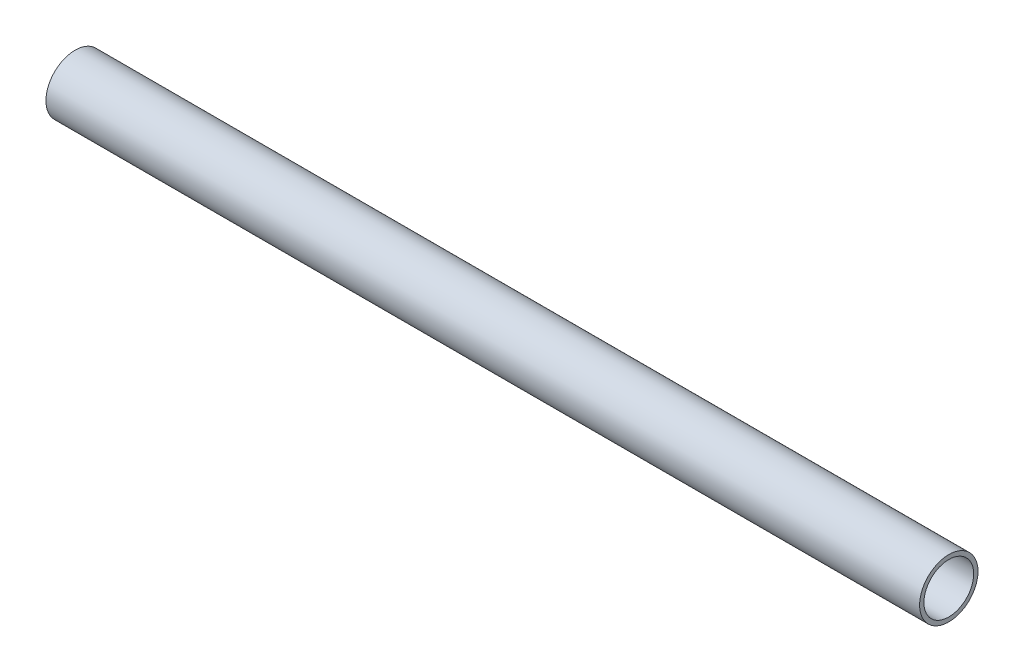
ISO-10303-21;
HEADER;
FILE_DESCRIPTION(('STEP AP214'),'2;1');
FILE_NAME('part.step','',(''),(''),'','','');
FILE_SCHEMA(('AUTOMOTIVE_DESIGN { 1 0 10303 214 1 1 1 1 }'));
ENDSEC;
DATA;
#1=APPLICATION_CONTEXT('core data for automotive mechanical design processes');
#2=APPLICATION_PROTOCOL_DEFINITION('international standard','automotive_design',2000,#1);
#3=PRODUCT_CONTEXT('',#1,'mechanical');
#4=PRODUCT('Part','Part','',(#3));
#5=PRODUCT_RELATED_PRODUCT_CATEGORY('part','',(#4));
#6=PRODUCT_DEFINITION_FORMATION('','',#4);
#7=PRODUCT_DEFINITION_CONTEXT('part definition',#1,'design');
#8=PRODUCT_DEFINITION('design','',#6,#7);
#9=PRODUCT_DEFINITION_SHAPE('','',#8);
#10=(LENGTH_UNIT() NAMED_UNIT(*) SI_UNIT(.MILLI.,.METRE.));
#11=(NAMED_UNIT(*) PLANE_ANGLE_UNIT() SI_UNIT($,.RADIAN.));
#12=(NAMED_UNIT(*) SI_UNIT($,.STERADIAN.) SOLID_ANGLE_UNIT());
#13=UNCERTAINTY_MEASURE_WITH_UNIT(LENGTH_MEASURE(1.E-05),#10,'distance_accuracy_value','');
#14=(GEOMETRIC_REPRESENTATION_CONTEXT(3) GLOBAL_UNCERTAINTY_ASSIGNED_CONTEXT((#13)) GLOBAL_UNIT_ASSIGNED_CONTEXT((#10,
#11,#12)) REPRESENTATION_CONTEXT('',''));
#15=CARTESIAN_POINT('',(0.,0.,0.));
#16=DIRECTION('',(0.,0.,1.));
#17=DIRECTION('',(1.,0.,0.));
#18=AXIS2_PLACEMENT_3D('',#15,#16,#17);
#19=CARTESIAN_POINT('',(-250.825,0.,0.));
#20=DIRECTION('',(1.,0.,0.));
#21=DIRECTION('',(0.,0.,-1.));
#22=AXIS2_PLACEMENT_3D('',#19,#20,#21);
#23=CYLINDRICAL_SURFACE('',#22,13.335);
#24=CARTESIAN_POINT('',(225.425,0.,0.));
#25=DIRECTION('',(1.,0.,0.));
#26=DIRECTION('',(0.,0.,-1.));
#27=AXIS2_PLACEMENT_3D('',#24,#25,#26);
#28=CIRCLE('',#27,13.335);
#29=CARTESIAN_POINT('',(225.425,0.,-13.335));
#30=VERTEX_POINT('',#29);
#31=EDGE_CURVE('E17',#30,#30,#28,.F.);
#32=ORIENTED_EDGE('',*,*,#31,.F.);
#33=EDGE_LOOP('',(#32));
#34=FACE_BOUND('',#33,.T.);
#35=CARTESIAN_POINT('',(-225.425,0.,0.));
#36=DIRECTION('',(1.,0.,0.));
#37=DIRECTION('',(0.,0.,-1.));
#38=AXIS2_PLACEMENT_3D('',#35,#36,#37);
#39=CIRCLE('',#38,13.335);
#40=CARTESIAN_POINT('',(-225.425,0.,-13.335));
#41=VERTEX_POINT('',#40);
#42=EDGE_CURVE('E39',#41,#41,#39,.F.);
#43=ORIENTED_EDGE('',*,*,#42,.T.);
#44=EDGE_LOOP('',(#43));
#45=FACE_BOUND('',#44,.T.);
#46=ADVANCED_FACE('F14',(#34,#45),#23,.F.);
#47=CARTESIAN_POINT('',(225.425,0.,0.));
#48=DIRECTION('',(1.,0.,0.));
#49=DIRECTION('',(0.,0.,-1.));
#50=AXIS2_PLACEMENT_3D('',#47,#48,#49);
#51=PLANE('',#50);
#52=ORIENTED_EDGE('',*,*,#31,.T.);
#53=EDGE_LOOP('',(#52));
#54=FACE_BOUND('',#53,.T.);
#55=CARTESIAN_POINT('',(225.425,0.,0.));
#56=DIRECTION('',(1.,0.,0.));
#57=DIRECTION('',(0.,0.,-1.));
#58=AXIS2_PLACEMENT_3D('',#55,#56,#57);
#59=CIRCLE('',#58,14.2875);
#60=CARTESIAN_POINT('',(225.425,0.,-14.2875));
#61=VERTEX_POINT('',#60);
#62=EDGE_CURVE('E37',#61,#61,#59,.T.);
#63=ORIENTED_EDGE('',*,*,#62,.T.);
#64=EDGE_LOOP('',(#63));
#65=FACE_BOUND('',#64,.T.);
#66=ADVANCED_FACE('F46',(#54,#65),#51,.T.);
#67=CARTESIAN_POINT('',(-225.425,0.,0.));
#68=DIRECTION('',(1.,0.,0.));
#69=DIRECTION('',(0.,0.,-1.));
#70=AXIS2_PLACEMENT_3D('',#67,#68,#69);
#71=PLANE('',#70);
#72=ORIENTED_EDGE('',*,*,#42,.F.);
#73=EDGE_LOOP('',(#72));
#74=FACE_BOUND('',#73,.T.);
#75=CARTESIAN_POINT('',(-225.425,0.,0.));
#76=DIRECTION('',(1.,0.,0.));
#77=DIRECTION('',(0.,0.,-1.));
#78=AXIS2_PLACEMENT_3D('',#75,#76,#77);
#79=CIRCLE('',#78,14.2875);
#80=CARTESIAN_POINT('',(-225.425,0.,-14.2875));
#81=VERTEX_POINT('',#80);
#82=EDGE_CURVE('E34',#81,#81,#79,.F.);
#83=ORIENTED_EDGE('',*,*,#82,.T.);
#84=EDGE_LOOP('',(#83));
#85=FACE_BOUND('',#84,.T.);
#86=ADVANCED_FACE('F54',(#74,#85),#71,.F.);
#87=CARTESIAN_POINT('',(250.825,0.,0.));
#88=DIRECTION('',(1.,0.,0.));
#89=DIRECTION('',(0.,0.,-1.));
#90=AXIS2_PLACEMENT_3D('',#87,#88,#89);
#91=CYLINDRICAL_SURFACE('',#90,14.2875);
#92=ORIENTED_EDGE('',*,*,#62,.F.);
#93=EDGE_LOOP('',(#92));
#94=FACE_BOUND('',#93,.T.);
#95=CARTESIAN_POINT('',(250.825,0.,0.));
#96=DIRECTION('',(1.,0.,0.));
#97=DIRECTION('',(0.,0.,-1.));
#98=AXIS2_PLACEMENT_3D('',#95,#96,#97);
#99=CIRCLE('',#98,14.2875);
#100=CARTESIAN_POINT('',(250.825,0.,-14.2875));
#101=VERTEX_POINT('',#100);
#102=EDGE_CURVE('E31',#101,#101,#99,.F.);
#103=ORIENTED_EDGE('',*,*,#102,.F.);
#104=EDGE_LOOP('',(#103));
#105=FACE_BOUND('',#104,.T.);
#106=ADVANCED_FACE('F73',(#94,#105),#91,.F.);
#107=CARTESIAN_POINT('',(-250.825,0.,0.));
#108=DIRECTION('',(1.,0.,0.));
#109=DIRECTION('',(0.,0.,-1.));
#110=AXIS2_PLACEMENT_3D('',#107,#108,#109);
#111=CYLINDRICAL_SURFACE('',#110,14.2875);
#112=ORIENTED_EDGE('',*,*,#82,.F.);
#113=EDGE_LOOP('',(#112));
#114=FACE_BOUND('',#113,.T.);
#115=CARTESIAN_POINT('',(-250.825,0.,0.));
#116=DIRECTION('',(1.,0.,0.));
#117=DIRECTION('',(0.,0.,-1.));
#118=AXIS2_PLACEMENT_3D('',#115,#116,#117);
#119=CIRCLE('',#118,14.2875);
#120=CARTESIAN_POINT('',(-250.825,0.,-14.2875));
#121=VERTEX_POINT('',#120);
#122=EDGE_CURVE('E26',#121,#121,#119,.F.);
#123=ORIENTED_EDGE('',*,*,#122,.T.);
#124=EDGE_LOOP('',(#123));
#125=FACE_BOUND('',#124,.T.);
#126=ADVANCED_FACE('F69',(#114,#125),#111,.F.);
#127=CARTESIAN_POINT('',(250.825,0.,0.));
#128=DIRECTION('',(1.,0.,0.));
#129=DIRECTION('',(0.,0.,-1.));
#130=AXIS2_PLACEMENT_3D('',#127,#128,#129);
#131=PLANE('',#130);
#132=ORIENTED_EDGE('',*,*,#102,.T.);
#133=EDGE_LOOP('',(#132));
#134=FACE_BOUND('',#133,.T.);
#135=CARTESIAN_POINT('',(250.825,0.,0.));
#136=DIRECTION('',(1.,0.,0.));
#137=DIRECTION('',(0.,0.,-1.));
#138=AXIS2_PLACEMENT_3D('',#135,#136,#137);
#139=CIRCLE('',#138,16.764);
#140=CARTESIAN_POINT('',(250.825,0.,-16.764));
#141=VERTEX_POINT('',#140);
#142=EDGE_CURVE('E21',#141,#141,#139,.F.);
#143=ORIENTED_EDGE('',*,*,#142,.F.);
#144=EDGE_LOOP('',(#143));
#145=FACE_BOUND('',#144,.T.);
#146=ADVANCED_FACE('F63',(#134,#145),#131,.T.);
#147=CARTESIAN_POINT('',(-250.825,0.,0.));
#148=DIRECTION('',(1.,0.,0.));
#149=DIRECTION('',(0.,0.,-1.));
#150=AXIS2_PLACEMENT_3D('',#147,#148,#149);
#151=PLANE('',#150);
#152=ORIENTED_EDGE('',*,*,#122,.F.);
#153=EDGE_LOOP('',(#152));
#154=FACE_BOUND('',#153,.T.);
#155=CARTESIAN_POINT('',(-250.825,0.,0.));
#156=DIRECTION('',(1.,0.,0.));
#157=DIRECTION('',(0.,0.,-1.));
#158=AXIS2_PLACEMENT_3D('',#155,#156,#157);
#159=CIRCLE('',#158,16.764);
#160=CARTESIAN_POINT('',(-250.825,0.,-16.764));
#161=VERTEX_POINT('',#160);
#162=EDGE_CURVE('E10',#161,#161,#159,.T.);
#163=ORIENTED_EDGE('',*,*,#162,.F.);
#164=EDGE_LOOP('',(#163));
#165=FACE_BOUND('',#164,.T.);
#166=ADVANCED_FACE('F57',(#154,#165),#151,.F.);
#167=CARTESIAN_POINT('',(-250.825,0.,0.));
#168=DIRECTION('',(1.,0.,0.));
#169=DIRECTION('',(0.,0.,-1.));
#170=AXIS2_PLACEMENT_3D('',#167,#168,#169);
#171=CYLINDRICAL_SURFACE('',#170,16.764);
#172=ORIENTED_EDGE('',*,*,#142,.T.);
#173=EDGE_LOOP('',(#172));
#174=FACE_BOUND('',#173,.T.);
#175=ORIENTED_EDGE('',*,*,#162,.T.);
#176=EDGE_LOOP('',(#175));
#177=FACE_BOUND('',#176,.T.);
#178=ADVANCED_FACE('F55',(#174,#177),#171,.T.);
#179=CLOSED_SHELL('',(#46,#66,#86,#106,#126,#146,#166,#178));
#180=MANIFOLD_SOLID_BREP('B1',#179);
#181=ADVANCED_BREP_SHAPE_REPRESENTATION('',(#18,#180),#14);
#182=SHAPE_DEFINITION_REPRESENTATION(#9,#181);
ENDSEC;
END-ISO-10303-21;
